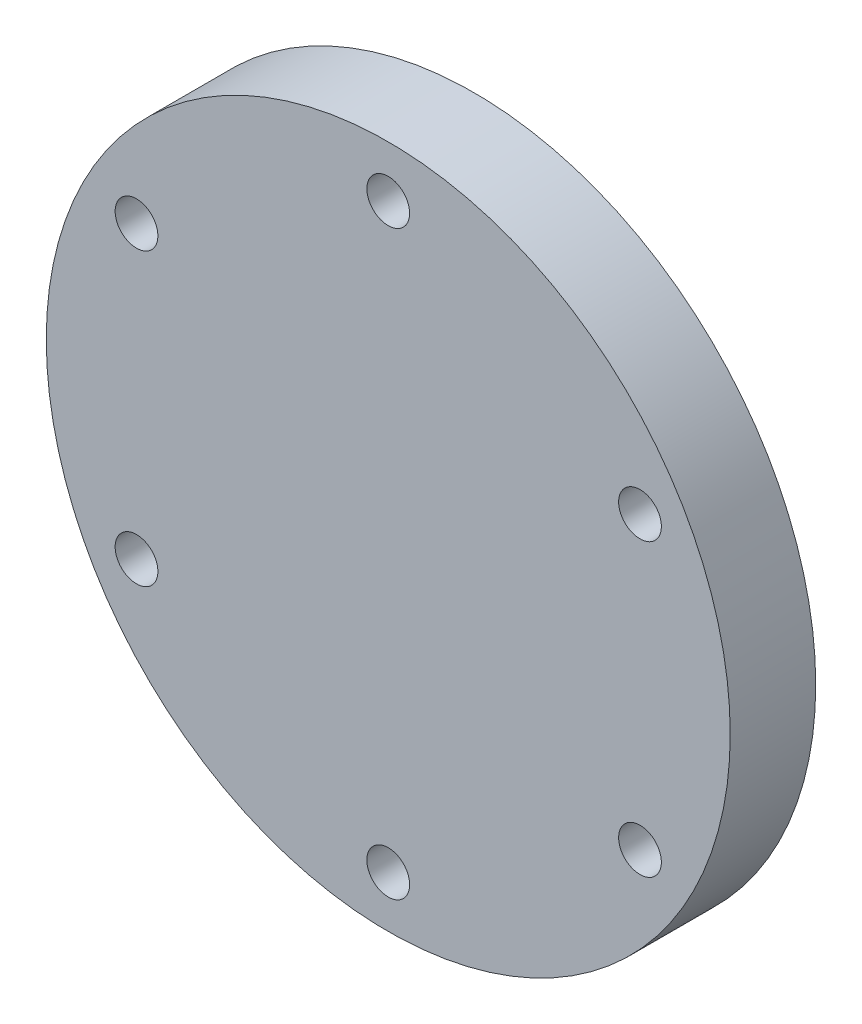
ISO-10303-21;
HEADER;
FILE_DESCRIPTION(('STEP AP214'),'2;1');
FILE_NAME('part.step','',(''),(''),'','','');
FILE_SCHEMA(('AUTOMOTIVE_DESIGN { 1 0 10303 214 1 1 1 1 }'));
ENDSEC;
DATA;
#1=APPLICATION_CONTEXT('core data for automotive mechanical design processes');
#2=APPLICATION_PROTOCOL_DEFINITION('international standard','automotive_design',2000,#1);
#3=PRODUCT_CONTEXT('',#1,'mechanical');
#4=PRODUCT('Part','Part','',(#3));
#5=PRODUCT_RELATED_PRODUCT_CATEGORY('part','',(#4));
#6=PRODUCT_DEFINITION_FORMATION('','',#4);
#7=PRODUCT_DEFINITION_CONTEXT('part definition',#1,'design');
#8=PRODUCT_DEFINITION('design','',#6,#7);
#9=PRODUCT_DEFINITION_SHAPE('','',#8);
#10=(LENGTH_UNIT() NAMED_UNIT(*) SI_UNIT(.MILLI.,.METRE.));
#11=(NAMED_UNIT(*) PLANE_ANGLE_UNIT() SI_UNIT($,.RADIAN.));
#12=(NAMED_UNIT(*) SI_UNIT($,.STERADIAN.) SOLID_ANGLE_UNIT());
#13=UNCERTAINTY_MEASURE_WITH_UNIT(LENGTH_MEASURE(1.E-05),#10,'distance_accuracy_value','');
#14=(GEOMETRIC_REPRESENTATION_CONTEXT(3) GLOBAL_UNCERTAINTY_ASSIGNED_CONTEXT((#13)) GLOBAL_UNIT_ASSIGNED_CONTEXT((#10,
#11,#12)) REPRESENTATION_CONTEXT('',''));
#15=CARTESIAN_POINT('',(0.,0.,0.));
#16=DIRECTION('',(0.,0.,1.));
#17=DIRECTION('',(1.,0.,0.));
#18=AXIS2_PLACEMENT_3D('',#15,#16,#17);
#19=CARTESIAN_POINT('',(0.,0.,5.));
#20=DIRECTION('',(0.,0.,1.));
#21=DIRECTION('',(1.,0.,0.));
#22=AXIS2_PLACEMENT_3D('',#19,#20,#21);
#23=PLANE('',#22);
#24=CARTESIAN_POINT('',(-14.7224318643344,-8.50000000000063,5.));
#25=DIRECTION('',(0.,0.,1.));
#26=DIRECTION('',(1.,0.,0.));
#27=AXIS2_PLACEMENT_3D('',#24,#25,#26);
#28=CIRCLE('',#27,1.25000000000138);
#29=CARTESIAN_POINT('',(-13.472431864333,-8.50000000000063,5.));
#30=VERTEX_POINT('',#29);
#31=EDGE_CURVE('E65',#30,#30,#28,.T.);
#32=ORIENTED_EDGE('',*,*,#31,.F.);
#33=EDGE_LOOP('',(#32));
#34=FACE_BOUND('',#33,.T.);
#35=CARTESIAN_POINT('',(14.7224318643365,-8.49999999999937,5.));
#36=DIRECTION('',(0.,0.,1.));
#37=DIRECTION('',(1.,0.,0.));
#38=AXIS2_PLACEMENT_3D('',#35,#36,#37);
#39=CIRCLE('',#38,1.25000000000093);
#40=CARTESIAN_POINT('',(15.9724318643375,-8.49999999999937,5.));
#41=VERTEX_POINT('',#40);
#42=EDGE_CURVE('E53',#41,#41,#39,.T.);
#43=ORIENTED_EDGE('',*,*,#42,.F.);
#44=EDGE_LOOP('',(#43));
#45=FACE_BOUND('',#44,.T.);
#46=CARTESIAN_POINT('',(0.,17.,5.));
#47=DIRECTION('',(0.,0.,1.));
#48=DIRECTION('',(1.,0.,0.));
#49=AXIS2_PLACEMENT_3D('',#46,#47,#48);
#50=CIRCLE('',#49,1.25);
#51=CARTESIAN_POINT('',(1.25,17.,5.));
#52=VERTEX_POINT('',#51);
#53=EDGE_CURVE('E42',#52,#52,#50,.T.);
#54=ORIENTED_EDGE('',*,*,#53,.F.);
#55=EDGE_LOOP('',(#54));
#56=FACE_BOUND('',#55,.T.);
#57=CARTESIAN_POINT('',(0.,0.,5.));
#58=DIRECTION('',(0.,0.,1.));
#59=DIRECTION('',(1.,0.,0.));
#60=AXIS2_PLACEMENT_3D('',#57,#58,#59);
#61=CIRCLE('',#60,20.);
#62=CARTESIAN_POINT('',(20.,0.,5.));
#63=VERTEX_POINT('',#62);
#64=EDGE_CURVE('E10',#63,#63,#61,.T.);
#65=ORIENTED_EDGE('',*,*,#64,.T.);
#66=EDGE_LOOP('',(#65));
#67=FACE_BOUND('',#66,.T.);
#68=CARTESIAN_POINT('',(14.7224318643358,8.50000000000063,5.));
#69=DIRECTION('',(0.,0.,1.));
#70=DIRECTION('',(1.,0.,0.));
#71=AXIS2_PLACEMENT_3D('',#68,#69,#70);
#72=CIRCLE('',#71,1.25000000000021);
#73=CARTESIAN_POINT('',(15.972431864336,8.50000000000063,5.));
#74=VERTEX_POINT('',#73);
#75=EDGE_CURVE('E47',#74,#74,#72,.T.);
#76=ORIENTED_EDGE('',*,*,#75,.F.);
#77=EDGE_LOOP('',(#76));
#78=FACE_BOUND('',#77,.T.);
#79=CARTESIAN_POINT('',(1.4453433818335E-12,-17.,5.));
#80=DIRECTION('',(0.,0.,1.));
#81=DIRECTION('',(1.,0.,0.));
#82=AXIS2_PLACEMENT_3D('',#79,#80,#81);
#83=CIRCLE('',#82,1.2500000000015);
#84=CARTESIAN_POINT('',(1.25000000000294,-17.,5.));
#85=VERTEX_POINT('',#84);
#86=EDGE_CURVE('E59',#85,#85,#83,.T.);
#87=ORIENTED_EDGE('',*,*,#86,.F.);
#88=EDGE_LOOP('',(#87));
#89=FACE_BOUND('',#88,.T.);
#90=CARTESIAN_POINT('',(-14.7224318643351,8.49999999999936,5.));
#91=DIRECTION('',(0.,0.,1.));
#92=DIRECTION('',(1.,0.,0.));
#93=AXIS2_PLACEMENT_3D('',#90,#91,#92);
#94=CIRCLE('',#93,1.25000000000073);
#95=CARTESIAN_POINT('',(-13.4724318643344,8.49999999999936,5.));
#96=VERTEX_POINT('',#95);
#97=EDGE_CURVE('E71',#96,#96,#94,.T.);
#98=ORIENTED_EDGE('',*,*,#97,.F.);
#99=EDGE_LOOP('',(#98));
#100=FACE_BOUND('',#99,.T.);
#101=ADVANCED_FACE('F31',(#34,#45,#56,#67,#78,#89,#100),#23,.T.);
#102=CARTESIAN_POINT('',(0.,0.,0.));
#103=DIRECTION('',(0.,0.,1.));
#104=DIRECTION('',(1.,0.,0.));
#105=AXIS2_PLACEMENT_3D('',#102,#103,#104);
#106=PLANE('',#105);
#107=CARTESIAN_POINT('',(0.,0.,0.));
#108=DIRECTION('',(0.,0.,1.));
#109=DIRECTION('',(1.,0.,0.));
#110=AXIS2_PLACEMENT_3D('',#107,#108,#109);
#111=CIRCLE('',#110,20.);
#112=CARTESIAN_POINT('',(20.,0.,0.));
#113=VERTEX_POINT('',#112);
#114=EDGE_CURVE('E35',#113,#113,#111,.T.);
#115=ORIENTED_EDGE('',*,*,#114,.F.);
#116=EDGE_LOOP('',(#115));
#117=FACE_BOUND('',#116,.T.);
#118=CARTESIAN_POINT('',(0.,17.,0.));
#119=DIRECTION('',(0.,0.,1.));
#120=DIRECTION('',(1.,0.,0.));
#121=AXIS2_PLACEMENT_3D('',#118,#119,#120);
#122=CIRCLE('',#121,1.25);
#123=CARTESIAN_POINT('',(1.25,17.,0.));
#124=VERTEX_POINT('',#123);
#125=EDGE_CURVE('E44',#124,#124,#122,.T.);
#126=ORIENTED_EDGE('',*,*,#125,.T.);
#127=EDGE_LOOP('',(#126));
#128=FACE_BOUND('',#127,.T.);
#129=CARTESIAN_POINT('',(14.7224318643358,8.50000000000063,0.));
#130=DIRECTION('',(0.,0.,1.));
#131=DIRECTION('',(1.,0.,0.));
#132=AXIS2_PLACEMENT_3D('',#129,#130,#131);
#133=CIRCLE('',#132,1.25000000000021);
#134=CARTESIAN_POINT('',(15.972431864336,8.50000000000063,0.));
#135=VERTEX_POINT('',#134);
#136=EDGE_CURVE('E50',#135,#135,#133,.T.);
#137=ORIENTED_EDGE('',*,*,#136,.T.);
#138=EDGE_LOOP('',(#137));
#139=FACE_BOUND('',#138,.T.);
#140=CARTESIAN_POINT('',(14.7224318643365,-8.49999999999937,0.));
#141=DIRECTION('',(0.,0.,1.));
#142=DIRECTION('',(1.,0.,0.));
#143=AXIS2_PLACEMENT_3D('',#140,#141,#142);
#144=CIRCLE('',#143,1.25000000000093);
#145=CARTESIAN_POINT('',(15.9724318643375,-8.49999999999937,0.));
#146=VERTEX_POINT('',#145);
#147=EDGE_CURVE('E56',#146,#146,#144,.T.);
#148=ORIENTED_EDGE('',*,*,#147,.T.);
#149=EDGE_LOOP('',(#148));
#150=FACE_BOUND('',#149,.T.);
#151=CARTESIAN_POINT('',(1.4453433818335E-12,-17.,0.));
#152=DIRECTION('',(0.,0.,1.));
#153=DIRECTION('',(1.,0.,0.));
#154=AXIS2_PLACEMENT_3D('',#151,#152,#153);
#155=CIRCLE('',#154,1.2500000000015);
#156=CARTESIAN_POINT('',(1.25000000000294,-17.,0.));
#157=VERTEX_POINT('',#156);
#158=EDGE_CURVE('E62',#157,#157,#155,.T.);
#159=ORIENTED_EDGE('',*,*,#158,.T.);
#160=EDGE_LOOP('',(#159));
#161=FACE_BOUND('',#160,.T.);
#162=CARTESIAN_POINT('',(-14.7224318643344,-8.50000000000063,0.));
#163=DIRECTION('',(0.,0.,1.));
#164=DIRECTION('',(1.,0.,0.));
#165=AXIS2_PLACEMENT_3D('',#162,#163,#164);
#166=CIRCLE('',#165,1.25000000000138);
#167=CARTESIAN_POINT('',(-13.472431864333,-8.50000000000063,0.));
#168=VERTEX_POINT('',#167);
#169=EDGE_CURVE('E68',#168,#168,#166,.T.);
#170=ORIENTED_EDGE('',*,*,#169,.T.);
#171=EDGE_LOOP('',(#170));
#172=FACE_BOUND('',#171,.T.);
#173=CARTESIAN_POINT('',(-14.7224318643351,8.49999999999936,0.));
#174=DIRECTION('',(0.,0.,1.));
#175=DIRECTION('',(1.,0.,0.));
#176=AXIS2_PLACEMENT_3D('',#173,#174,#175);
#177=CIRCLE('',#176,1.25000000000073);
#178=CARTESIAN_POINT('',(-13.4724318643344,8.49999999999936,0.));
#179=VERTEX_POINT('',#178);
#180=EDGE_CURVE('E74',#179,#179,#177,.T.);
#181=ORIENTED_EDGE('',*,*,#180,.T.);
#182=EDGE_LOOP('',(#181));
#183=FACE_BOUND('',#182,.T.);
#184=ADVANCED_FACE('F84',(#117,#128,#139,#150,#161,#172,#183),#106,.F.);
#185=CARTESIAN_POINT('',(0.,0.,5.));
#186=DIRECTION('',(0.,0.,-1.));
#187=DIRECTION('',(-1.,0.,0.));
#188=AXIS2_PLACEMENT_3D('',#185,#186,#187);
#189=CYLINDRICAL_SURFACE('',#188,20.);
#190=ORIENTED_EDGE('',*,*,#64,.F.);
#191=EDGE_LOOP('',(#190));
#192=FACE_BOUND('',#191,.T.);
#193=ORIENTED_EDGE('',*,*,#114,.T.);
#194=EDGE_LOOP('',(#193));
#195=FACE_BOUND('',#194,.T.);
#196=ADVANCED_FACE('F33',(#192,#195),#189,.T.);
#197=CARTESIAN_POINT('',(0.,17.,5.));
#198=DIRECTION('',(0.,0.,-1.));
#199=DIRECTION('',(-1.,0.,0.));
#200=AXIS2_PLACEMENT_3D('',#197,#198,#199);
#201=CYLINDRICAL_SURFACE('',#200,1.25);
#202=ORIENTED_EDGE('',*,*,#53,.T.);
#203=EDGE_LOOP('',(#202));
#204=FACE_BOUND('',#203,.T.);
#205=ORIENTED_EDGE('',*,*,#125,.F.);
#206=EDGE_LOOP('',(#205));
#207=FACE_BOUND('',#206,.T.);
#208=ADVANCED_FACE('F94',(#204,#207),#201,.F.);
#209=CARTESIAN_POINT('',(14.7224318643358,8.50000000000063,5.));
#210=DIRECTION('',(0.,0.,-1.));
#211=DIRECTION('',(-1.,0.,0.));
#212=AXIS2_PLACEMENT_3D('',#209,#210,#211);
#213=CYLINDRICAL_SURFACE('',#212,1.25000000000021);
#214=ORIENTED_EDGE('',*,*,#75,.T.);
#215=EDGE_LOOP('',(#214));
#216=FACE_BOUND('',#215,.T.);
#217=ORIENTED_EDGE('',*,*,#136,.F.);
#218=EDGE_LOOP('',(#217));
#219=FACE_BOUND('',#218,.T.);
#220=ADVANCED_FACE('F97',(#216,#219),#213,.F.);
#221=CARTESIAN_POINT('',(14.7224318643365,-8.49999999999937,5.));
#222=DIRECTION('',(0.,0.,-1.));
#223=DIRECTION('',(-1.,0.,0.));
#224=AXIS2_PLACEMENT_3D('',#221,#222,#223);
#225=CYLINDRICAL_SURFACE('',#224,1.25000000000093);
#226=ORIENTED_EDGE('',*,*,#42,.T.);
#227=EDGE_LOOP('',(#226));
#228=FACE_BOUND('',#227,.T.);
#229=ORIENTED_EDGE('',*,*,#147,.F.);
#230=EDGE_LOOP('',(#229));
#231=FACE_BOUND('',#230,.T.);
#232=ADVANCED_FACE('F101',(#228,#231),#225,.F.);
#233=CARTESIAN_POINT('',(1.4453433818335E-12,-17.,5.));
#234=DIRECTION('',(0.,0.,-1.));
#235=DIRECTION('',(-1.,0.,0.));
#236=AXIS2_PLACEMENT_3D('',#233,#234,#235);
#237=CYLINDRICAL_SURFACE('',#236,1.2500000000015);
#238=ORIENTED_EDGE('',*,*,#86,.T.);
#239=EDGE_LOOP('',(#238));
#240=FACE_BOUND('',#239,.T.);
#241=ORIENTED_EDGE('',*,*,#158,.F.);
#242=EDGE_LOOP('',(#241));
#243=FACE_BOUND('',#242,.T.);
#244=ADVANCED_FACE('F105',(#240,#243),#237,.F.);
#245=CARTESIAN_POINT('',(-14.7224318643344,-8.50000000000063,5.));
#246=DIRECTION('',(0.,0.,-1.));
#247=DIRECTION('',(-1.,0.,0.));
#248=AXIS2_PLACEMENT_3D('',#245,#246,#247);
#249=CYLINDRICAL_SURFACE('',#248,1.25000000000138);
#250=ORIENTED_EDGE('',*,*,#31,.T.);
#251=EDGE_LOOP('',(#250));
#252=FACE_BOUND('',#251,.T.);
#253=ORIENTED_EDGE('',*,*,#169,.F.);
#254=EDGE_LOOP('',(#253));
#255=FACE_BOUND('',#254,.T.);
#256=ADVANCED_FACE('F109',(#252,#255),#249,.F.);
#257=CARTESIAN_POINT('',(-14.7224318643351,8.49999999999936,5.));
#258=DIRECTION('',(0.,0.,-1.));
#259=DIRECTION('',(-1.,0.,0.));
#260=AXIS2_PLACEMENT_3D('',#257,#258,#259);
#261=CYLINDRICAL_SURFACE('',#260,1.25000000000073);
#262=ORIENTED_EDGE('',*,*,#97,.T.);
#263=EDGE_LOOP('',(#262));
#264=FACE_BOUND('',#263,.T.);
#265=ORIENTED_EDGE('',*,*,#180,.F.);
#266=EDGE_LOOP('',(#265));
#267=FACE_BOUND('',#266,.T.);
#268=ADVANCED_FACE('F80',(#264,#267),#261,.F.);
#269=CLOSED_SHELL('',(#101,#184,#196,#208,#220,#232,#244,#256,#268));
#270=MANIFOLD_SOLID_BREP('B2',#269);
#271=ADVANCED_BREP_SHAPE_REPRESENTATION('',(#18,#270),#14);
#272=SHAPE_DEFINITION_REPRESENTATION(#9,#271);
ENDSEC;
END-ISO-10303-21;
